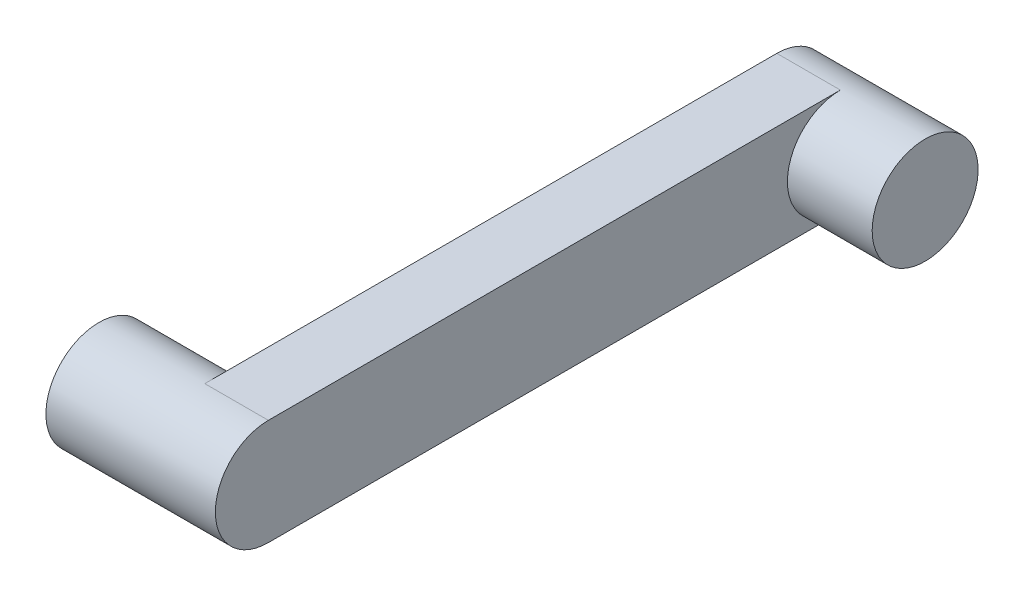
ISO-10303-21;
HEADER;
FILE_DESCRIPTION(('STEP AP214'),'2;1');
FILE_NAME('part.step','',(''),(''),'','','');
FILE_SCHEMA(('AUTOMOTIVE_DESIGN { 1 0 10303 214 1 1 1 1 }'));
ENDSEC;
DATA;
#1=APPLICATION_CONTEXT('core data for automotive mechanical design processes');
#2=APPLICATION_PROTOCOL_DEFINITION('international standard','automotive_design',2000,#1);
#3=PRODUCT_CONTEXT('',#1,'mechanical');
#4=PRODUCT('Part','Part','',(#3));
#5=PRODUCT_RELATED_PRODUCT_CATEGORY('part','',(#4));
#6=PRODUCT_DEFINITION_FORMATION('','',#4);
#7=PRODUCT_DEFINITION_CONTEXT('part definition',#1,'design');
#8=PRODUCT_DEFINITION('design','',#6,#7);
#9=PRODUCT_DEFINITION_SHAPE('','',#8);
#10=(LENGTH_UNIT() NAMED_UNIT(*) SI_UNIT(.MILLI.,.METRE.));
#11=(NAMED_UNIT(*) PLANE_ANGLE_UNIT() SI_UNIT($,.RADIAN.));
#12=(NAMED_UNIT(*) SI_UNIT($,.STERADIAN.) SOLID_ANGLE_UNIT());
#13=UNCERTAINTY_MEASURE_WITH_UNIT(LENGTH_MEASURE(1.E-05),#10,'distance_accuracy_value','');
#14=(GEOMETRIC_REPRESENTATION_CONTEXT(3) GLOBAL_UNCERTAINTY_ASSIGNED_CONTEXT((#13)) GLOBAL_UNIT_ASSIGNED_CONTEXT((#10,
#11,#12)) REPRESENTATION_CONTEXT('',''));
#15=CARTESIAN_POINT('',(0.,0.,0.));
#16=DIRECTION('',(0.,0.,1.));
#17=DIRECTION('',(1.,0.,0.));
#18=AXIS2_PLACEMENT_3D('',#15,#16,#17);
#19=CARTESIAN_POINT('',(3.,2.5,13.5));
#20=DIRECTION('',(0.,-1.,0.));
#21=DIRECTION('',(0.,0.,-1.));
#22=AXIS2_PLACEMENT_3D('',#19,#20,#21);
#23=PLANE('',#22);
#24=DIRECTION('',(0.,0.,1.));
#25=VECTOR('',#24,1.);
#26=CARTESIAN_POINT('',(0.,2.5,13.5));
#27=LINE('',#26,#25);
#28=CARTESIAN_POINT('',(0.,2.5,-13.5));
#29=VERTEX_POINT('',#28);
#30=CARTESIAN_POINT('',(0.,2.5,13.5));
#31=VERTEX_POINT('',#30);
#32=EDGE_CURVE('E80',#29,#31,#27,.T.);
#33=ORIENTED_EDGE('',*,*,#32,.T.);
#34=DIRECTION('',(-1.,0.,0.));
#35=VECTOR('',#34,1.);
#36=CARTESIAN_POINT('',(3.,2.5,13.5));
#37=LINE('',#36,#35);
#38=CARTESIAN_POINT('',(3.,2.5,13.5));
#39=VERTEX_POINT('',#38);
#40=EDGE_CURVE('E90',#39,#31,#37,.T.);
#41=ORIENTED_EDGE('',*,*,#40,.F.);
#42=DIRECTION('',(0.,0.,1.));
#43=VECTOR('',#42,1.);
#44=CARTESIAN_POINT('',(3.,2.5,13.5));
#45=LINE('',#44,#43);
#46=CARTESIAN_POINT('',(3.,2.5,-13.5));
#47=VERTEX_POINT('',#46);
#48=EDGE_CURVE('E89',#47,#39,#45,.T.);
#49=ORIENTED_EDGE('',*,*,#48,.F.);
#50=DIRECTION('',(-1.,0.,0.));
#51=VECTOR('',#50,1.);
#52=CARTESIAN_POINT('',(3.,2.5,-13.5));
#53=LINE('',#52,#51);
#54=EDGE_CURVE('E40',#47,#29,#53,.T.);
#55=ORIENTED_EDGE('',*,*,#54,.T.);
#56=EDGE_LOOP('',(#33,#41,#49,#55));
#57=FACE_BOUND('',#56,.T.);
#58=ADVANCED_FACE('F32',(#57),#23,.F.);
#59=CARTESIAN_POINT('',(3.,-2.5,13.5));
#60=DIRECTION('',(0.,1.,0.));
#61=DIRECTION('',(0.,0.,1.));
#62=AXIS2_PLACEMENT_3D('',#59,#60,#61);
#63=PLANE('',#62);
#64=DIRECTION('',(0.,0.,-1.));
#65=VECTOR('',#64,1.);
#66=CARTESIAN_POINT('',(0.,-2.5,13.5));
#67=LINE('',#66,#65);
#68=CARTESIAN_POINT('',(0.,-2.5,13.5));
#69=VERTEX_POINT('',#68);
#70=CARTESIAN_POINT('',(0.,-2.5,-13.5));
#71=VERTEX_POINT('',#70);
#72=EDGE_CURVE('E85',#69,#71,#67,.T.);
#73=ORIENTED_EDGE('',*,*,#72,.T.);
#74=DIRECTION('',(-1.,0.,0.));
#75=VECTOR('',#74,1.);
#76=CARTESIAN_POINT('',(3.,-2.5,-13.5));
#77=LINE('',#76,#75);
#78=CARTESIAN_POINT('',(3.,-2.5,-13.5));
#79=VERTEX_POINT('',#78);
#80=EDGE_CURVE('E73',#79,#71,#77,.T.);
#81=ORIENTED_EDGE('',*,*,#80,.F.);
#82=DIRECTION('',(0.,0.,-1.));
#83=VECTOR('',#82,1.);
#84=CARTESIAN_POINT('',(3.,-2.5,13.5));
#85=LINE('',#84,#83);
#86=CARTESIAN_POINT('',(3.,-2.5,13.5));
#87=VERTEX_POINT('',#86);
#88=EDGE_CURVE('E47',#87,#79,#85,.T.);
#89=ORIENTED_EDGE('',*,*,#88,.F.);
#90=DIRECTION('',(-1.,0.,0.));
#91=VECTOR('',#90,1.);
#92=CARTESIAN_POINT('',(3.,-2.5,13.5));
#93=LINE('',#92,#91);
#94=EDGE_CURVE('E91',#87,#69,#93,.T.);
#95=ORIENTED_EDGE('',*,*,#94,.T.);
#96=EDGE_LOOP('',(#73,#81,#89,#95));
#97=FACE_BOUND('',#96,.T.);
#98=ADVANCED_FACE('F119',(#97),#63,.F.);
#99=CARTESIAN_POINT('',(3.,0.,0.));
#100=DIRECTION('',(-1.,0.,0.));
#101=DIRECTION('',(0.,0.,1.));
#102=AXIS2_PLACEMENT_3D('',#99,#100,#101);
#103=PLANE('',#102);
#104=ORIENTED_EDGE('',*,*,#88,.T.);
#105=CARTESIAN_POINT('',(3.,0.,-13.5));
#106=DIRECTION('',(-1.,0.,0.));
#107=DIRECTION('',(0.,0.,1.));
#108=AXIS2_PLACEMENT_3D('',#105,#106,#107);
#109=CIRCLE('',#108,2.5);
#110=EDGE_CURVE('E102',#79,#47,#109,.T.);
#111=ORIENTED_EDGE('',*,*,#110,.T.);
#112=ORIENTED_EDGE('',*,*,#48,.T.);
#113=CARTESIAN_POINT('',(3.,0.,13.5));
#114=DIRECTION('',(1.,0.,0.));
#115=DIRECTION('',(0.,0.,-1.));
#116=AXIS2_PLACEMENT_3D('',#113,#114,#115);
#117=CIRCLE('',#116,2.5);
#118=EDGE_CURVE('E99',#39,#87,#117,.T.);
#119=ORIENTED_EDGE('',*,*,#118,.T.);
#120=EDGE_LOOP('',(#104,#111,#112,#119));
#121=FACE_BOUND('',#120,.T.);
#122=ADVANCED_FACE('F123',(#121),#103,.F.);
#123=CARTESIAN_POINT('',(0.,0.,0.));
#124=DIRECTION('',(-1.,0.,0.));
#125=DIRECTION('',(0.,0.,1.));
#126=AXIS2_PLACEMENT_3D('',#123,#124,#125);
#127=PLANE('',#126);
#128=ORIENTED_EDGE('',*,*,#32,.F.);
#129=CARTESIAN_POINT('',(0.,0.,-13.5));
#130=DIRECTION('',(-1.,0.,0.));
#131=DIRECTION('',(0.,0.,1.));
#132=AXIS2_PLACEMENT_3D('',#129,#130,#131);
#133=CIRCLE('',#132,2.5);
#134=EDGE_CURVE('E68',#29,#71,#133,.T.);
#135=ORIENTED_EDGE('',*,*,#134,.T.);
#136=ORIENTED_EDGE('',*,*,#72,.F.);
#137=CARTESIAN_POINT('',(0.,0.,13.5));
#138=DIRECTION('',(-1.,0.,0.));
#139=DIRECTION('',(0.,0.,1.));
#140=AXIS2_PLACEMENT_3D('',#137,#138,#139);
#141=CIRCLE('',#140,2.5);
#142=EDGE_CURVE('E11',#31,#69,#141,.T.);
#143=ORIENTED_EDGE('',*,*,#142,.F.);
#144=EDGE_LOOP('',(#128,#135,#136,#143));
#145=FACE_BOUND('',#144,.T.);
#146=ADVANCED_FACE('F81',(#145),#127,.T.);
#147=CARTESIAN_POINT('',(-5.,0.,13.5));
#148=DIRECTION('',(1.,0.,0.));
#149=DIRECTION('',(0.,0.,-1.));
#150=AXIS2_PLACEMENT_3D('',#147,#148,#149);
#151=CYLINDRICAL_SURFACE('',#150,2.5);
#152=CARTESIAN_POINT('',(-5.,0.,13.5));
#153=DIRECTION('',(1.,0.,0.));
#154=DIRECTION('',(0.,0.,-1.));
#155=AXIS2_PLACEMENT_3D('',#152,#153,#154);
#156=CIRCLE('',#155,2.5);
#157=CARTESIAN_POINT('',(-5.,0.,11.));
#158=VERTEX_POINT('',#157);
#159=EDGE_CURVE('E86',#158,#158,#156,.T.);
#160=ORIENTED_EDGE('',*,*,#159,.T.);
#161=EDGE_LOOP('',(#160));
#162=FACE_BOUND('',#161,.T.);
#163=ORIENTED_EDGE('',*,*,#40,.T.);
#164=ORIENTED_EDGE('',*,*,#142,.T.);
#165=ORIENTED_EDGE('',*,*,#94,.F.);
#166=ORIENTED_EDGE('',*,*,#118,.F.);
#167=EDGE_LOOP('',(#163,#164,#165,#166));
#168=FACE_BOUND('',#167,.T.);
#169=ADVANCED_FACE('F131',(#162,#168),#151,.T.);
#170=CARTESIAN_POINT('',(-5.,0.,13.5));
#171=DIRECTION('',(1.,0.,0.));
#172=DIRECTION('',(0.,0.,-1.));
#173=AXIS2_PLACEMENT_3D('',#170,#171,#172);
#174=PLANE('',#173);
#175=ORIENTED_EDGE('',*,*,#159,.F.);
#176=EDGE_LOOP('',(#175));
#177=FACE_BOUND('',#176,.T.);
#178=ADVANCED_FACE('F116',(#177),#174,.F.);
#179=CARTESIAN_POINT('',(7.,0.,-13.5));
#180=DIRECTION('',(-1.,0.,0.));
#181=DIRECTION('',(0.,0.,1.));
#182=AXIS2_PLACEMENT_3D('',#179,#180,#181);
#183=CYLINDRICAL_SURFACE('',#182,2.5);
#184=CARTESIAN_POINT('',(7.,0.,-13.5));
#185=DIRECTION('',(-1.,0.,0.));
#186=DIRECTION('',(0.,0.,1.));
#187=AXIS2_PLACEMENT_3D('',#184,#185,#186);
#188=CIRCLE('',#187,2.5);
#189=CARTESIAN_POINT('',(7.,0.,-11.));
#190=VERTEX_POINT('',#189);
#191=EDGE_CURVE('E76',#190,#190,#188,.T.);
#192=ORIENTED_EDGE('',*,*,#191,.T.);
#193=EDGE_LOOP('',(#192));
#194=FACE_BOUND('',#193,.T.);
#195=ORIENTED_EDGE('',*,*,#54,.F.);
#196=ORIENTED_EDGE('',*,*,#110,.F.);
#197=ORIENTED_EDGE('',*,*,#80,.T.);
#198=ORIENTED_EDGE('',*,*,#134,.F.);
#199=EDGE_LOOP('',(#195,#196,#197,#198));
#200=FACE_BOUND('',#199,.T.);
#201=ADVANCED_FACE('F70',(#194,#200),#183,.T.);
#202=CARTESIAN_POINT('',(7.,0.,-13.5));
#203=DIRECTION('',(-1.,0.,0.));
#204=DIRECTION('',(0.,0.,1.));
#205=AXIS2_PLACEMENT_3D('',#202,#203,#204);
#206=PLANE('',#205);
#207=ORIENTED_EDGE('',*,*,#191,.F.);
#208=EDGE_LOOP('',(#207));
#209=FACE_BOUND('',#208,.T.);
#210=ADVANCED_FACE('F110',(#209),#206,.F.);
#211=CLOSED_SHELL('',(#58,#98,#122,#146,#169,#178,#201,#210));
#212=MANIFOLD_SOLID_BREP('B2',#211);
#213=ADVANCED_BREP_SHAPE_REPRESENTATION('',(#18,#212),#14);
#214=SHAPE_DEFINITION_REPRESENTATION(#9,#213);
ENDSEC;
END-ISO-10303-21;
